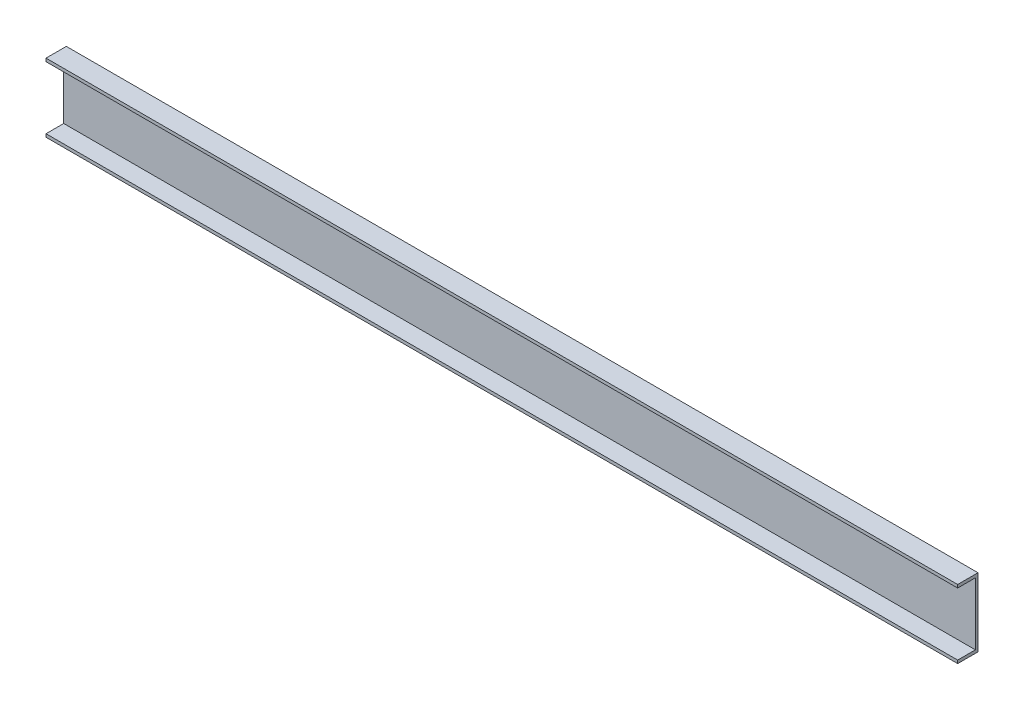
ISO-10303-21;
HEADER;
FILE_DESCRIPTION(('STEP AP214'),'2;1');
FILE_NAME('part.step','',(''),(''),'','','');
FILE_SCHEMA(('AUTOMOTIVE_DESIGN { 1 0 10303 214 1 1 1 1 }'));
ENDSEC;
DATA;
#1=APPLICATION_CONTEXT('core data for automotive mechanical design processes');
#2=APPLICATION_PROTOCOL_DEFINITION('international standard','automotive_design',2000,#1);
#3=PRODUCT_CONTEXT('',#1,'mechanical');
#4=PRODUCT('Part','Part','',(#3));
#5=PRODUCT_RELATED_PRODUCT_CATEGORY('part','',(#4));
#6=PRODUCT_DEFINITION_FORMATION('','',#4);
#7=PRODUCT_DEFINITION_CONTEXT('part definition',#1,'design');
#8=PRODUCT_DEFINITION('design','',#6,#7);
#9=PRODUCT_DEFINITION_SHAPE('','',#8);
#10=(LENGTH_UNIT() NAMED_UNIT(*) SI_UNIT(.MILLI.,.METRE.));
#11=(NAMED_UNIT(*) PLANE_ANGLE_UNIT() SI_UNIT($,.RADIAN.));
#12=(NAMED_UNIT(*) SI_UNIT($,.STERADIAN.) SOLID_ANGLE_UNIT());
#13=UNCERTAINTY_MEASURE_WITH_UNIT(LENGTH_MEASURE(1.E-05),#10,'distance_accuracy_value','');
#14=(GEOMETRIC_REPRESENTATION_CONTEXT(3) GLOBAL_UNCERTAINTY_ASSIGNED_CONTEXT((#13)) GLOBAL_UNIT_ASSIGNED_CONTEXT((#10,
#11,#12)) REPRESENTATION_CONTEXT('',''));
#15=CARTESIAN_POINT('',(0.,0.,0.));
#16=DIRECTION('',(0.,0.,1.));
#17=DIRECTION('',(1.,0.,0.));
#18=AXIS2_PLACEMENT_3D('',#15,#16,#17);
#19=CARTESIAN_POINT('',(-1995.,-150.,0.));
#20=DIRECTION('',(0.,0.,1.));
#21=DIRECTION('',(1.,0.,0.));
#22=AXIS2_PLACEMENT_3D('',#19,#20,#21);
#23=PLANE('',#22);
#24=DIRECTION('',(1.,0.,0.));
#25=VECTOR('',#24,1.);
#26=CARTESIAN_POINT('',(-1995.,-150.,0.));
#27=LINE('',#26,#25);
#28=CARTESIAN_POINT('',(-1995.,-150.,0.));
#29=VERTEX_POINT('',#28);
#30=CARTESIAN_POINT('',(1995.,-150.,0.));
#31=VERTEX_POINT('',#30);
#32=EDGE_CURVE('E481',#29,#31,#27,.T.);
#33=ORIENTED_EDGE('',*,*,#32,.F.);
#34=DIRECTION('',(0.,-1.,0.));
#35=VECTOR('',#34,1.);
#36=CARTESIAN_POINT('',(-1995.,150.,0.));
#37=LINE('',#36,#35);
#38=CARTESIAN_POINT('',(-1995.,150.,0.));
#39=VERTEX_POINT('',#38);
#40=EDGE_CURVE('E473',#39,#29,#37,.T.);
#41=ORIENTED_EDGE('',*,*,#40,.F.);
#42=DIRECTION('',(-1.,0.,0.));
#43=VECTOR('',#42,1.);
#44=CARTESIAN_POINT('',(-1995.,150.,0.));
#45=LINE('',#44,#43);
#46=CARTESIAN_POINT('',(1995.,150.,0.));
#47=VERTEX_POINT('',#46);
#48=EDGE_CURVE('E477',#47,#39,#45,.T.);
#49=ORIENTED_EDGE('',*,*,#48,.F.);
#50=DIRECTION('',(0.,1.,0.));
#51=VECTOR('',#50,1.);
#52=CARTESIAN_POINT('',(1995.,150.,0.));
#53=LINE('',#52,#51);
#54=EDGE_CURVE('E483',#31,#47,#53,.T.);
#55=ORIENTED_EDGE('',*,*,#54,.F.);
#56=EDGE_LOOP('',(#33,#41,#49,#55));
#57=FACE_BOUND('',#56,.T.);
#58=DIRECTION('',(1.,0.,0.));
#59=VECTOR('',#58,1.);
#60=CARTESIAN_POINT('',(-935.,115.,0.));
#61=LINE('',#60,#59);
#62=CARTESIAN_POINT('',(-935.,115.,0.));
#63=VERTEX_POINT('',#62);
#64=CARTESIAN_POINT('',(-865.,115.,0.));
#65=VERTEX_POINT('',#64);
#66=EDGE_CURVE('E264',#63,#65,#61,.T.);
#67=ORIENTED_EDGE('',*,*,#66,.F.);
#68=DIRECTION('',(0.,1.,0.));
#69=VECTOR('',#68,1.);
#70=CARTESIAN_POINT('',(-935.,115.,0.));
#71=LINE('',#70,#69);
#72=CARTESIAN_POINT('',(-935.,-115.,0.));
#73=VERTEX_POINT('',#72);
#74=EDGE_CURVE('E277',#73,#63,#71,.T.);
#75=ORIENTED_EDGE('',*,*,#74,.F.);
#76=DIRECTION('',(-1.,0.,0.));
#77=VECTOR('',#76,1.);
#78=CARTESIAN_POINT('',(-935.,-115.,0.));
#79=LINE('',#78,#77);
#80=CARTESIAN_POINT('',(-865.,-115.,0.));
#81=VERTEX_POINT('',#80);
#82=EDGE_CURVE('E286',#81,#73,#79,.T.);
#83=ORIENTED_EDGE('',*,*,#82,.F.);
#84=DIRECTION('',(0.,-1.,0.));
#85=VECTOR('',#84,1.);
#86=CARTESIAN_POINT('',(-865.,115.,0.));
#87=LINE('',#86,#85);
#88=EDGE_CURVE('E267',#65,#81,#87,.T.);
#89=ORIENTED_EDGE('',*,*,#88,.F.);
#90=EDGE_LOOP('',(#67,#75,#83,#89));
#91=FACE_BOUND('',#90,.T.);
#92=DIRECTION('',(0.,-1.,0.));
#93=VECTOR('',#92,1.);
#94=CARTESIAN_POINT('',(535.,115.,0.));
#95=LINE('',#94,#93);
#96=CARTESIAN_POINT('',(535.,115.,0.));
#97=VERTEX_POINT('',#96);
#98=CARTESIAN_POINT('',(535.,-115.,0.));
#99=VERTEX_POINT('',#98);
#100=EDGE_CURVE('E335',#97,#99,#95,.T.);
#101=ORIENTED_EDGE('',*,*,#100,.F.);
#102=DIRECTION('',(1.,0.,0.));
#103=VECTOR('',#102,1.);
#104=CARTESIAN_POINT('',(535.,115.,0.));
#105=LINE('',#104,#103);
#106=CARTESIAN_POINT('',(465.,115.,0.));
#107=VERTEX_POINT('',#106);
#108=EDGE_CURVE('E340',#107,#97,#105,.T.);
#109=ORIENTED_EDGE('',*,*,#108,.F.);
#110=DIRECTION('',(0.,1.,0.));
#111=VECTOR('',#110,1.);
#112=CARTESIAN_POINT('',(465.,115.,0.));
#113=LINE('',#112,#111);
#114=CARTESIAN_POINT('',(465.,-115.,0.));
#115=VERTEX_POINT('',#114);
#116=EDGE_CURVE('E352',#115,#107,#113,.T.);
#117=ORIENTED_EDGE('',*,*,#116,.F.);
#118=DIRECTION('',(-1.,0.,0.));
#119=VECTOR('',#118,1.);
#120=CARTESIAN_POINT('',(535.,-115.,0.));
#121=LINE('',#120,#119);
#122=EDGE_CURVE('E349',#99,#115,#121,.T.);
#123=ORIENTED_EDGE('',*,*,#122,.F.);
#124=EDGE_LOOP('',(#101,#109,#117,#123));
#125=FACE_BOUND('',#124,.T.);
#126=DIRECTION('',(0.,-1.,0.));
#127=VECTOR('',#126,1.);
#128=CARTESIAN_POINT('',(1335.,115.,0.));
#129=LINE('',#128,#127);
#130=CARTESIAN_POINT('',(1335.,115.,0.));
#131=VERTEX_POINT('',#130);
#132=CARTESIAN_POINT('',(1335.,-115.,0.));
#133=VERTEX_POINT('',#132);
#134=EDGE_CURVE('E401',#131,#133,#129,.T.);
#135=ORIENTED_EDGE('',*,*,#134,.F.);
#136=DIRECTION('',(1.,0.,0.));
#137=VECTOR('',#136,1.);
#138=CARTESIAN_POINT('',(1335.,115.,0.));
#139=LINE('',#138,#137);
#140=CARTESIAN_POINT('',(1265.,115.,0.));
#141=VERTEX_POINT('',#140);
#142=EDGE_CURVE('E406',#141,#131,#139,.T.);
#143=ORIENTED_EDGE('',*,*,#142,.F.);
#144=DIRECTION('',(0.,1.,0.));
#145=VECTOR('',#144,1.);
#146=CARTESIAN_POINT('',(1265.,115.,0.));
#147=LINE('',#146,#145);
#148=CARTESIAN_POINT('',(1265.,-115.,0.));
#149=VERTEX_POINT('',#148);
#150=EDGE_CURVE('E418',#149,#141,#147,.T.);
#151=ORIENTED_EDGE('',*,*,#150,.F.);
#152=DIRECTION('',(-1.,0.,0.));
#153=VECTOR('',#152,1.);
#154=CARTESIAN_POINT('',(1335.,-115.,0.));
#155=LINE('',#154,#153);
#156=EDGE_CURVE('E415',#133,#149,#155,.T.);
#157=ORIENTED_EDGE('',*,*,#156,.F.);
#158=EDGE_LOOP('',(#135,#143,#151,#157));
#159=FACE_BOUND('',#158,.T.);
#160=DIRECTION('',(0.,-1.,0.));
#161=VECTOR('',#160,1.);
#162=CARTESIAN_POINT('',(935.,115.,0.));
#163=LINE('',#162,#161);
#164=CARTESIAN_POINT('',(935.,115.,0.));
#165=VERTEX_POINT('',#164);
#166=CARTESIAN_POINT('',(935.,-115.,0.));
#167=VERTEX_POINT('',#166);
#168=EDGE_CURVE('E368',#165,#167,#163,.T.);
#169=ORIENTED_EDGE('',*,*,#168,.F.);
#170=DIRECTION('',(1.,0.,0.));
#171=VECTOR('',#170,1.);
#172=CARTESIAN_POINT('',(935.,115.,0.));
#173=LINE('',#172,#171);
#174=CARTESIAN_POINT('',(865.,115.,0.));
#175=VERTEX_POINT('',#174);
#176=EDGE_CURVE('E373',#175,#165,#173,.T.);
#177=ORIENTED_EDGE('',*,*,#176,.F.);
#178=DIRECTION('',(0.,1.,0.));
#179=VECTOR('',#178,1.);
#180=CARTESIAN_POINT('',(865.,115.,0.));
#181=LINE('',#180,#179);
#182=CARTESIAN_POINT('',(865.,-115.,0.));
#183=VERTEX_POINT('',#182);
#184=EDGE_CURVE('E385',#183,#175,#181,.T.);
#185=ORIENTED_EDGE('',*,*,#184,.F.);
#186=DIRECTION('',(-1.,0.,0.));
#187=VECTOR('',#186,1.);
#188=CARTESIAN_POINT('',(935.,-115.,0.));
#189=LINE('',#188,#187);
#190=EDGE_CURVE('E382',#167,#183,#189,.T.);
#191=ORIENTED_EDGE('',*,*,#190,.F.);
#192=EDGE_LOOP('',(#169,#177,#185,#191));
#193=FACE_BOUND('',#192,.T.);
#194=DIRECTION('',(1.,0.,0.));
#195=VECTOR('',#194,1.);
#196=CARTESIAN_POINT('',(-535.,115.,0.));
#197=LINE('',#196,#195);
#198=CARTESIAN_POINT('',(-535.,115.,0.));
#199=VERTEX_POINT('',#198);
#200=CARTESIAN_POINT('',(-465.,115.,0.));
#201=VERTEX_POINT('',#200);
#202=EDGE_CURVE('E302',#199,#201,#197,.T.);
#203=ORIENTED_EDGE('',*,*,#202,.F.);
#204=DIRECTION('',(0.,1.,0.));
#205=VECTOR('',#204,1.);
#206=CARTESIAN_POINT('',(-535.,115.,0.));
#207=LINE('',#206,#205);
#208=CARTESIAN_POINT('',(-535.,-115.,0.));
#209=VERTEX_POINT('',#208);
#210=EDGE_CURVE('E307',#209,#199,#207,.T.);
#211=ORIENTED_EDGE('',*,*,#210,.F.);
#212=DIRECTION('',(-1.,0.,0.));
#213=VECTOR('',#212,1.);
#214=CARTESIAN_POINT('',(-535.,-115.,0.));
#215=LINE('',#214,#213);
#216=CARTESIAN_POINT('',(-465.,-115.,0.));
#217=VERTEX_POINT('',#216);
#218=EDGE_CURVE('E319',#217,#209,#215,.T.);
#219=ORIENTED_EDGE('',*,*,#218,.F.);
#220=DIRECTION('',(0.,-1.,0.));
#221=VECTOR('',#220,1.);
#222=CARTESIAN_POINT('',(-465.,115.,0.));
#223=LINE('',#222,#221);
#224=EDGE_CURVE('E316',#201,#217,#223,.T.);
#225=ORIENTED_EDGE('',*,*,#224,.F.);
#226=EDGE_LOOP('',(#203,#211,#219,#225));
#227=FACE_BOUND('',#226,.T.);
#228=DIRECTION('',(1.,0.,0.));
#229=VECTOR('',#228,1.);
#230=CARTESIAN_POINT('',(-1335.,115.,0.));
#231=LINE('',#230,#229);
#232=CARTESIAN_POINT('',(-1335.,115.,0.));
#233=VERTEX_POINT('',#232);
#234=CARTESIAN_POINT('',(-1265.,115.,0.));
#235=VERTEX_POINT('',#234);
#236=EDGE_CURVE('E263',#233,#235,#231,.T.);
#237=ORIENTED_EDGE('',*,*,#236,.F.);
#238=DIRECTION('',(0.,1.,0.));
#239=VECTOR('',#238,1.);
#240=CARTESIAN_POINT('',(-1335.,115.,0.));
#241=LINE('',#240,#239);
#242=CARTESIAN_POINT('',(-1335.,-115.,0.));
#243=VERTEX_POINT('',#242);
#244=EDGE_CURVE('E260',#243,#233,#241,.T.);
#245=ORIENTED_EDGE('',*,*,#244,.F.);
#246=DIRECTION('',(-1.,0.,0.));
#247=VECTOR('',#246,1.);
#248=CARTESIAN_POINT('',(-1335.,-115.,0.));
#249=LINE('',#248,#247);
#250=CARTESIAN_POINT('',(-1265.,-115.,0.));
#251=VERTEX_POINT('',#250);
#252=EDGE_CURVE('E54',#251,#243,#249,.T.);
#253=ORIENTED_EDGE('',*,*,#252,.F.);
#254=DIRECTION('',(0.,-1.,0.));
#255=VECTOR('',#254,1.);
#256=CARTESIAN_POINT('',(-1265.,115.,0.));
#257=LINE('',#256,#255);
#258=EDGE_CURVE('E49',#235,#251,#257,.T.);
#259=ORIENTED_EDGE('',*,*,#258,.F.);
#260=EDGE_LOOP('',(#237,#245,#253,#259));
#261=FACE_BOUND('',#260,.T.);
#262=ADVANCED_FACE('F34',(#57,#91,#125,#159,#193,#227,#261),#23,.F.);
#263=CARTESIAN_POINT('',(-1995.,-150.,11.5));
#264=DIRECTION('',(0.,0.,1.));
#265=DIRECTION('',(1.,0.,0.));
#266=AXIS2_PLACEMENT_3D('',#263,#264,#265);
#267=PLANE('',#266);
#268=DIRECTION('',(0.,-1.,0.));
#269=VECTOR('',#268,1.);
#270=CARTESIAN_POINT('',(-1995.,150.,11.5));
#271=LINE('',#270,#269);
#272=CARTESIAN_POINT('',(-1995.,136.5,11.5));
#273=VERTEX_POINT('',#272);
#274=CARTESIAN_POINT('',(-1995.,-136.5,11.5));
#275=VERTEX_POINT('',#274);
#276=EDGE_CURVE('E474',#273,#275,#271,.T.);
#277=ORIENTED_EDGE('',*,*,#276,.T.);
#278=DIRECTION('',(-1.,0.,0.));
#279=VECTOR('',#278,1.);
#280=CARTESIAN_POINT('',(-1995.,-136.5,11.5));
#281=LINE('',#280,#279);
#282=CARTESIAN_POINT('',(1995.,-136.5,11.5));
#283=VERTEX_POINT('',#282);
#284=EDGE_CURVE('E434',#283,#275,#281,.T.);
#285=ORIENTED_EDGE('',*,*,#284,.F.);
#286=DIRECTION('',(0.,1.,0.));
#287=VECTOR('',#286,1.);
#288=CARTESIAN_POINT('',(1995.,150.,11.5));
#289=LINE('',#288,#287);
#290=CARTESIAN_POINT('',(1995.,136.5,11.5));
#291=VERTEX_POINT('',#290);
#292=EDGE_CURVE('E476',#283,#291,#289,.T.);
#293=ORIENTED_EDGE('',*,*,#292,.T.);
#294=DIRECTION('',(1.,0.,0.));
#295=VECTOR('',#294,1.);
#296=CARTESIAN_POINT('',(-1995.,136.5,11.5));
#297=LINE('',#296,#295);
#298=EDGE_CURVE('E453',#273,#291,#297,.T.);
#299=ORIENTED_EDGE('',*,*,#298,.F.);
#300=EDGE_LOOP('',(#277,#285,#293,#299));
#301=FACE_BOUND('',#300,.T.);
#302=ADVANCED_FACE('F518',(#301),#267,.T.);
#303=CARTESIAN_POINT('',(-1995.,150.,11.5));
#304=DIRECTION('',(1.,0.,0.));
#305=DIRECTION('',(0.,0.,-1.));
#306=AXIS2_PLACEMENT_3D('',#303,#304,#305);
#307=PLANE('',#306);
#308=DIRECTION('',(0.,0.,-1.));
#309=VECTOR('',#308,1.);
#310=CARTESIAN_POINT('',(-1995.,-136.5,89.));
#311=LINE('',#310,#309);
#312=CARTESIAN_POINT('',(-1995.,-136.5,89.));
#313=VERTEX_POINT('',#312);
#314=EDGE_CURVE('E445',#313,#275,#311,.T.);
#315=ORIENTED_EDGE('',*,*,#314,.T.);
#316=ORIENTED_EDGE('',*,*,#276,.F.);
#317=DIRECTION('',(0.,0.,-1.));
#318=VECTOR('',#317,1.);
#319=CARTESIAN_POINT('',(-1995.,136.5,89.));
#320=LINE('',#319,#318);
#321=CARTESIAN_POINT('',(-1995.,136.5,89.));
#322=VERTEX_POINT('',#321);
#323=EDGE_CURVE('E470',#322,#273,#320,.T.);
#324=ORIENTED_EDGE('',*,*,#323,.F.);
#325=DIRECTION('',(0.,-1.,0.));
#326=VECTOR('',#325,1.);
#327=CARTESIAN_POINT('',(-1995.,150.,89.));
#328=LINE('',#327,#326);
#329=CARTESIAN_POINT('',(-1995.,150.,89.));
#330=VERTEX_POINT('',#329);
#331=EDGE_CURVE('E454',#330,#322,#328,.T.);
#332=ORIENTED_EDGE('',*,*,#331,.F.);
#333=DIRECTION('',(0.,0.,-1.));
#334=VECTOR('',#333,1.);
#335=CARTESIAN_POINT('',(-1995.,150.,11.5));
#336=LINE('',#335,#334);
#337=EDGE_CURVE('E479',#330,#39,#336,.T.);
#338=ORIENTED_EDGE('',*,*,#337,.T.);
#339=ORIENTED_EDGE('',*,*,#40,.T.);
#340=DIRECTION('',(0.,0.,-1.));
#341=VECTOR('',#340,1.);
#342=CARTESIAN_POINT('',(-1995.,-150.,11.5));
#343=LINE('',#342,#341);
#344=CARTESIAN_POINT('',(-1995.,-150.,89.));
#345=VERTEX_POINT('',#344);
#346=EDGE_CURVE('E11',#345,#29,#343,.T.);
#347=ORIENTED_EDGE('',*,*,#346,.F.);
#348=DIRECTION('',(0.,-1.,0.));
#349=VECTOR('',#348,1.);
#350=CARTESIAN_POINT('',(-1995.,-150.,89.));
#351=LINE('',#350,#349);
#352=EDGE_CURVE('E442',#313,#345,#351,.T.);
#353=ORIENTED_EDGE('',*,*,#352,.F.);
#354=EDGE_LOOP('',(#315,#316,#324,#332,#338,#339,#347,#353));
#355=FACE_BOUND('',#354,.T.);
#356=ADVANCED_FACE('F36',(#355),#307,.F.);
#357=CARTESIAN_POINT('',(-1995.,-150.,11.5));
#358=DIRECTION('',(0.,1.,0.));
#359=DIRECTION('',(-1.,0.,0.));
#360=AXIS2_PLACEMENT_3D('',#357,#358,#359);
#361=PLANE('',#360);
#362=ORIENTED_EDGE('',*,*,#32,.T.);
#363=DIRECTION('',(0.,0.,-1.));
#364=VECTOR('',#363,1.);
#365=CARTESIAN_POINT('',(1995.,-150.,11.5));
#366=LINE('',#365,#364);
#367=CARTESIAN_POINT('',(1995.,-150.,89.));
#368=VERTEX_POINT('',#367);
#369=EDGE_CURVE('E42',#368,#31,#366,.T.);
#370=ORIENTED_EDGE('',*,*,#369,.F.);
#371=DIRECTION('',(1.,0.,0.));
#372=VECTOR('',#371,1.);
#373=CARTESIAN_POINT('',(-1995.,-150.,89.));
#374=LINE('',#373,#372);
#375=EDGE_CURVE('E435',#345,#368,#374,.T.);
#376=ORIENTED_EDGE('',*,*,#375,.F.);
#377=ORIENTED_EDGE('',*,*,#346,.T.);
#378=EDGE_LOOP('',(#362,#370,#376,#377));
#379=FACE_BOUND('',#378,.T.);
#380=ADVANCED_FACE('F526',(#379),#361,.F.);
#381=CARTESIAN_POINT('',(1995.,150.,11.5));
#382=DIRECTION('',(-1.,0.,0.));
#383=DIRECTION('',(0.,0.,1.));
#384=AXIS2_PLACEMENT_3D('',#381,#382,#383);
#385=PLANE('',#384);
#386=ORIENTED_EDGE('',*,*,#54,.T.);
#387=DIRECTION('',(0.,0.,-1.));
#388=VECTOR('',#387,1.);
#389=CARTESIAN_POINT('',(1995.,150.,11.5));
#390=LINE('',#389,#388);
#391=CARTESIAN_POINT('',(1995.,150.,89.));
#392=VERTEX_POINT('',#391);
#393=EDGE_CURVE('E488',#392,#47,#390,.T.);
#394=ORIENTED_EDGE('',*,*,#393,.F.);
#395=DIRECTION('',(0.,1.,0.));
#396=VECTOR('',#395,1.);
#397=CARTESIAN_POINT('',(1995.,150.,89.));
#398=LINE('',#397,#396);
#399=CARTESIAN_POINT('',(1995.,136.5,89.));
#400=VERTEX_POINT('',#399);
#401=EDGE_CURVE('E459',#400,#392,#398,.T.);
#402=ORIENTED_EDGE('',*,*,#401,.F.);
#403=DIRECTION('',(0.,0.,-1.));
#404=VECTOR('',#403,1.);
#405=CARTESIAN_POINT('',(1995.,136.5,89.));
#406=LINE('',#405,#404);
#407=EDGE_CURVE('E465',#400,#291,#406,.T.);
#408=ORIENTED_EDGE('',*,*,#407,.T.);
#409=ORIENTED_EDGE('',*,*,#292,.F.);
#410=DIRECTION('',(0.,0.,-1.));
#411=VECTOR('',#410,1.);
#412=CARTESIAN_POINT('',(1995.,-136.5,89.));
#413=LINE('',#412,#411);
#414=CARTESIAN_POINT('',(1995.,-136.5,89.));
#415=VERTEX_POINT('',#414);
#416=EDGE_CURVE('E450',#415,#283,#413,.T.);
#417=ORIENTED_EDGE('',*,*,#416,.F.);
#418=DIRECTION('',(0.,1.,0.));
#419=VECTOR('',#418,1.);
#420=CARTESIAN_POINT('',(1995.,-150.,89.));
#421=LINE('',#420,#419);
#422=EDGE_CURVE('E438',#368,#415,#421,.T.);
#423=ORIENTED_EDGE('',*,*,#422,.F.);
#424=ORIENTED_EDGE('',*,*,#369,.T.);
#425=EDGE_LOOP('',(#386,#394,#402,#408,#409,#417,#423,#424));
#426=FACE_BOUND('',#425,.T.);
#427=ADVANCED_FACE('F494',(#426),#385,.F.);
#428=CARTESIAN_POINT('',(-1995.,150.,11.5));
#429=DIRECTION('',(0.,-1.,0.));
#430=DIRECTION('',(1.,0.,0.));
#431=AXIS2_PLACEMENT_3D('',#428,#429,#430);
#432=PLANE('',#431);
#433=ORIENTED_EDGE('',*,*,#48,.T.);
#434=ORIENTED_EDGE('',*,*,#337,.F.);
#435=DIRECTION('',(-1.,0.,0.));
#436=VECTOR('',#435,1.);
#437=CARTESIAN_POINT('',(-1995.,150.,89.));
#438=LINE('',#437,#436);
#439=EDGE_CURVE('E462',#392,#330,#438,.T.);
#440=ORIENTED_EDGE('',*,*,#439,.F.);
#441=ORIENTED_EDGE('',*,*,#393,.T.);
#442=EDGE_LOOP('',(#433,#434,#440,#441));
#443=FACE_BOUND('',#442,.T.);
#444=ADVANCED_FACE('F504',(#443),#432,.F.);
#445=CARTESIAN_POINT('',(-1995.,136.5,89.));
#446=DIRECTION('',(0.,1.,0.));
#447=DIRECTION('',(0.,0.,1.));
#448=AXIS2_PLACEMENT_3D('',#445,#446,#447);
#449=PLANE('',#448);
#450=ORIENTED_EDGE('',*,*,#298,.T.);
#451=ORIENTED_EDGE('',*,*,#407,.F.);
#452=DIRECTION('',(1.,0.,0.));
#453=VECTOR('',#452,1.);
#454=CARTESIAN_POINT('',(-1995.,136.5,89.));
#455=LINE('',#454,#453);
#456=EDGE_CURVE('E457',#322,#400,#455,.T.);
#457=ORIENTED_EDGE('',*,*,#456,.F.);
#458=ORIENTED_EDGE('',*,*,#323,.T.);
#459=EDGE_LOOP('',(#450,#451,#457,#458));
#460=FACE_BOUND('',#459,.T.);
#461=ADVANCED_FACE('F516',(#460),#449,.F.);
#462=CARTESIAN_POINT('',(-1995.,136.5,89.));
#463=DIRECTION('',(0.,0.,1.));
#464=DIRECTION('',(1.,0.,0.));
#465=AXIS2_PLACEMENT_3D('',#462,#463,#464);
#466=PLANE('',#465);
#467=ORIENTED_EDGE('',*,*,#331,.T.);
#468=ORIENTED_EDGE('',*,*,#456,.T.);
#469=ORIENTED_EDGE('',*,*,#401,.T.);
#470=ORIENTED_EDGE('',*,*,#439,.T.);
#471=EDGE_LOOP('',(#467,#468,#469,#470));
#472=FACE_BOUND('',#471,.T.);
#473=ADVANCED_FACE('F511',(#472),#466,.T.);
#474=CARTESIAN_POINT('',(-1995.,-136.5,89.));
#475=DIRECTION('',(0.,-1.,0.));
#476=DIRECTION('',(0.,0.,-1.));
#477=AXIS2_PLACEMENT_3D('',#474,#475,#476);
#478=PLANE('',#477);
#479=ORIENTED_EDGE('',*,*,#284,.T.);
#480=ORIENTED_EDGE('',*,*,#314,.F.);
#481=DIRECTION('',(-1.,0.,0.));
#482=VECTOR('',#481,1.);
#483=CARTESIAN_POINT('',(-1995.,-136.5,89.));
#484=LINE('',#483,#482);
#485=EDGE_CURVE('E440',#415,#313,#484,.T.);
#486=ORIENTED_EDGE('',*,*,#485,.F.);
#487=ORIENTED_EDGE('',*,*,#416,.T.);
#488=EDGE_LOOP('',(#479,#480,#486,#487));
#489=FACE_BOUND('',#488,.T.);
#490=ADVANCED_FACE('F523',(#489),#478,.F.);
#491=CARTESIAN_POINT('',(1995.,-150.,89.));
#492=DIRECTION('',(0.,0.,1.));
#493=DIRECTION('',(1.,0.,0.));
#494=AXIS2_PLACEMENT_3D('',#491,#492,#493);
#495=PLANE('',#494);
#496=ORIENTED_EDGE('',*,*,#375,.T.);
#497=ORIENTED_EDGE('',*,*,#422,.T.);
#498=ORIENTED_EDGE('',*,*,#485,.T.);
#499=ORIENTED_EDGE('',*,*,#352,.T.);
#500=EDGE_LOOP('',(#496,#497,#498,#499));
#501=FACE_BOUND('',#500,.T.);
#502=ADVANCED_FACE('F525',(#501),#495,.T.);
#503=CARTESIAN_POINT('',(1335.,115.,-16.));
#504=DIRECTION('',(-1.,0.,0.));
#505=DIRECTION('',(0.,0.,1.));
#506=AXIS2_PLACEMENT_3D('',#503,#504,#505);
#507=PLANE('',#506);
#508=ORIENTED_EDGE('',*,*,#134,.T.);
#509=DIRECTION('',(0.,0.,1.));
#510=VECTOR('',#509,1.);
#511=CARTESIAN_POINT('',(1335.,-115.,-16.));
#512=LINE('',#511,#510);
#513=CARTESIAN_POINT('',(1335.,-115.,-16.));
#514=VERTEX_POINT('',#513);
#515=EDGE_CURVE('E431',#514,#133,#512,.T.);
#516=ORIENTED_EDGE('',*,*,#515,.F.);
#517=DIRECTION('',(0.,-1.,0.));
#518=VECTOR('',#517,1.);
#519=CARTESIAN_POINT('',(1335.,115.,-16.));
#520=LINE('',#519,#518);
#521=CARTESIAN_POINT('',(1335.,115.,-16.));
#522=VERTEX_POINT('',#521);
#523=EDGE_CURVE('E402',#522,#514,#520,.T.);
#524=ORIENTED_EDGE('',*,*,#523,.F.);
#525=DIRECTION('',(0.,0.,1.));
#526=VECTOR('',#525,1.);
#527=CARTESIAN_POINT('',(1335.,115.,-16.));
#528=LINE('',#527,#526);
#529=EDGE_CURVE('E412',#522,#131,#528,.T.);
#530=ORIENTED_EDGE('',*,*,#529,.T.);
#531=EDGE_LOOP('',(#508,#516,#524,#530));
#532=FACE_BOUND('',#531,.T.);
#533=ADVANCED_FACE('F554',(#532),#507,.F.);
#534=CARTESIAN_POINT('',(1335.,-115.,-16.));
#535=DIRECTION('',(0.,1.,0.));
#536=DIRECTION('',(0.,0.,1.));
#537=AXIS2_PLACEMENT_3D('',#534,#535,#536);
#538=PLANE('',#537);
#539=ORIENTED_EDGE('',*,*,#156,.T.);
#540=DIRECTION('',(0.,0.,1.));
#541=VECTOR('',#540,1.);
#542=CARTESIAN_POINT('',(1265.,-115.,-16.));
#543=LINE('',#542,#541);
#544=CARTESIAN_POINT('',(1265.,-115.,-16.));
#545=VERTEX_POINT('',#544);
#546=EDGE_CURVE('E428',#545,#149,#543,.T.);
#547=ORIENTED_EDGE('',*,*,#546,.F.);
#548=DIRECTION('',(-1.,0.,0.));
#549=VECTOR('',#548,1.);
#550=CARTESIAN_POINT('',(1335.,-115.,-16.));
#551=LINE('',#550,#549);
#552=EDGE_CURVE('E405',#514,#545,#551,.T.);
#553=ORIENTED_EDGE('',*,*,#552,.F.);
#554=ORIENTED_EDGE('',*,*,#515,.T.);
#555=EDGE_LOOP('',(#539,#547,#553,#554));
#556=FACE_BOUND('',#555,.T.);
#557=ADVANCED_FACE('F557',(#556),#538,.F.);
#558=CARTESIAN_POINT('',(1265.,115.,-16.));
#559=DIRECTION('',(1.,0.,0.));
#560=DIRECTION('',(0.,0.,-1.));
#561=AXIS2_PLACEMENT_3D('',#558,#559,#560);
#562=PLANE('',#561);
#563=ORIENTED_EDGE('',*,*,#150,.T.);
#564=DIRECTION('',(0.,0.,1.));
#565=VECTOR('',#564,1.);
#566=CARTESIAN_POINT('',(1265.,115.,-16.));
#567=LINE('',#566,#565);
#568=CARTESIAN_POINT('',(1265.,115.,-16.));
#569=VERTEX_POINT('',#568);
#570=EDGE_CURVE('E425',#569,#141,#567,.T.);
#571=ORIENTED_EDGE('',*,*,#570,.F.);
#572=DIRECTION('',(0.,1.,0.));
#573=VECTOR('',#572,1.);
#574=CARTESIAN_POINT('',(1265.,115.,-16.));
#575=LINE('',#574,#573);
#576=EDGE_CURVE('E408',#545,#569,#575,.T.);
#577=ORIENTED_EDGE('',*,*,#576,.F.);
#578=ORIENTED_EDGE('',*,*,#546,.T.);
#579=EDGE_LOOP('',(#563,#571,#577,#578));
#580=FACE_BOUND('',#579,.T.);
#581=ADVANCED_FACE('F561',(#580),#562,.F.);
#582=CARTESIAN_POINT('',(1335.,115.,-16.));
#583=DIRECTION('',(0.,-1.,0.));
#584=DIRECTION('',(0.,0.,-1.));
#585=AXIS2_PLACEMENT_3D('',#582,#583,#584);
#586=PLANE('',#585);
#587=ORIENTED_EDGE('',*,*,#142,.T.);
#588=ORIENTED_EDGE('',*,*,#529,.F.);
#589=DIRECTION('',(1.,0.,0.));
#590=VECTOR('',#589,1.);
#591=CARTESIAN_POINT('',(1335.,115.,-16.));
#592=LINE('',#591,#590);
#593=EDGE_CURVE('E410',#569,#522,#592,.T.);
#594=ORIENTED_EDGE('',*,*,#593,.F.);
#595=ORIENTED_EDGE('',*,*,#570,.T.);
#596=EDGE_LOOP('',(#587,#588,#594,#595));
#597=FACE_BOUND('',#596,.T.);
#598=ADVANCED_FACE('F565',(#597),#586,.F.);
#599=CARTESIAN_POINT('',(1335.,-115.,-16.));
#600=DIRECTION('',(0.,0.,-1.));
#601=DIRECTION('',(-1.,0.,0.));
#602=AXIS2_PLACEMENT_3D('',#599,#600,#601);
#603=PLANE('',#602);
#604=ORIENTED_EDGE('',*,*,#523,.T.);
#605=ORIENTED_EDGE('',*,*,#552,.T.);
#606=ORIENTED_EDGE('',*,*,#576,.T.);
#607=ORIENTED_EDGE('',*,*,#593,.T.);
#608=EDGE_LOOP('',(#604,#605,#606,#607));
#609=FACE_BOUND('',#608,.T.);
#610=ADVANCED_FACE('F569',(#609),#603,.T.);
#611=CARTESIAN_POINT('',(935.,115.,-16.));
#612=DIRECTION('',(-1.,0.,0.));
#613=DIRECTION('',(0.,0.,1.));
#614=AXIS2_PLACEMENT_3D('',#611,#612,#613);
#615=PLANE('',#614);
#616=ORIENTED_EDGE('',*,*,#168,.T.);
#617=DIRECTION('',(0.,0.,1.));
#618=VECTOR('',#617,1.);
#619=CARTESIAN_POINT('',(935.,-115.,-16.));
#620=LINE('',#619,#618);
#621=CARTESIAN_POINT('',(935.,-115.,-16.));
#622=VERTEX_POINT('',#621);
#623=EDGE_CURVE('E398',#622,#167,#620,.T.);
#624=ORIENTED_EDGE('',*,*,#623,.F.);
#625=DIRECTION('',(0.,-1.,0.));
#626=VECTOR('',#625,1.);
#627=CARTESIAN_POINT('',(935.,115.,-16.));
#628=LINE('',#627,#626);
#629=CARTESIAN_POINT('',(935.,115.,-16.));
#630=VERTEX_POINT('',#629);
#631=EDGE_CURVE('E369',#630,#622,#628,.T.);
#632=ORIENTED_EDGE('',*,*,#631,.F.);
#633=DIRECTION('',(0.,0.,1.));
#634=VECTOR('',#633,1.);
#635=CARTESIAN_POINT('',(935.,115.,-16.));
#636=LINE('',#635,#634);
#637=EDGE_CURVE('E379',#630,#165,#636,.T.);
#638=ORIENTED_EDGE('',*,*,#637,.T.);
#639=EDGE_LOOP('',(#616,#624,#632,#638));
#640=FACE_BOUND('',#639,.T.);
#641=ADVANCED_FACE('F573',(#640),#615,.F.);
#642=CARTESIAN_POINT('',(935.,-115.,-16.));
#643=DIRECTION('',(0.,1.,0.));
#644=DIRECTION('',(-1.,0.,0.));
#645=AXIS2_PLACEMENT_3D('',#642,#643,#644);
#646=PLANE('',#645);
#647=ORIENTED_EDGE('',*,*,#190,.T.);
#648=DIRECTION('',(0.,0.,1.));
#649=VECTOR('',#648,1.);
#650=CARTESIAN_POINT('',(865.,-115.,-16.));
#651=LINE('',#650,#649);
#652=CARTESIAN_POINT('',(865.,-115.,-16.));
#653=VERTEX_POINT('',#652);
#654=EDGE_CURVE('E395',#653,#183,#651,.T.);
#655=ORIENTED_EDGE('',*,*,#654,.F.);
#656=DIRECTION('',(-1.,0.,0.));
#657=VECTOR('',#656,1.);
#658=CARTESIAN_POINT('',(935.,-115.,-16.));
#659=LINE('',#658,#657);
#660=EDGE_CURVE('E372',#622,#653,#659,.T.);
#661=ORIENTED_EDGE('',*,*,#660,.F.);
#662=ORIENTED_EDGE('',*,*,#623,.T.);
#663=EDGE_LOOP('',(#647,#655,#661,#662));
#664=FACE_BOUND('',#663,.T.);
#665=ADVANCED_FACE('F577',(#664),#646,.F.);
#666=CARTESIAN_POINT('',(865.,115.,-16.));
#667=DIRECTION('',(1.,0.,0.));
#668=DIRECTION('',(0.,0.,-1.));
#669=AXIS2_PLACEMENT_3D('',#666,#667,#668);
#670=PLANE('',#669);
#671=ORIENTED_EDGE('',*,*,#184,.T.);
#672=DIRECTION('',(0.,0.,1.));
#673=VECTOR('',#672,1.);
#674=CARTESIAN_POINT('',(865.,115.,-16.));
#675=LINE('',#674,#673);
#676=CARTESIAN_POINT('',(865.,115.,-16.));
#677=VERTEX_POINT('',#676);
#678=EDGE_CURVE('E392',#677,#175,#675,.T.);
#679=ORIENTED_EDGE('',*,*,#678,.F.);
#680=DIRECTION('',(0.,1.,0.));
#681=VECTOR('',#680,1.);
#682=CARTESIAN_POINT('',(865.,115.,-16.));
#683=LINE('',#682,#681);
#684=EDGE_CURVE('E375',#653,#677,#683,.T.);
#685=ORIENTED_EDGE('',*,*,#684,.F.);
#686=ORIENTED_EDGE('',*,*,#654,.T.);
#687=EDGE_LOOP('',(#671,#679,#685,#686));
#688=FACE_BOUND('',#687,.T.);
#689=ADVANCED_FACE('F581',(#688),#670,.F.);
#690=CARTESIAN_POINT('',(935.,115.,-16.));
#691=DIRECTION('',(0.,-1.,0.));
#692=DIRECTION('',(1.,0.,0.));
#693=AXIS2_PLACEMENT_3D('',#690,#691,#692);
#694=PLANE('',#693);
#695=ORIENTED_EDGE('',*,*,#176,.T.);
#696=ORIENTED_EDGE('',*,*,#637,.F.);
#697=DIRECTION('',(1.,0.,0.));
#698=VECTOR('',#697,1.);
#699=CARTESIAN_POINT('',(935.,115.,-16.));
#700=LINE('',#699,#698);
#701=EDGE_CURVE('E377',#677,#630,#700,.T.);
#702=ORIENTED_EDGE('',*,*,#701,.F.);
#703=ORIENTED_EDGE('',*,*,#678,.T.);
#704=EDGE_LOOP('',(#695,#696,#702,#703));
#705=FACE_BOUND('',#704,.T.);
#706=ADVANCED_FACE('F585',(#705),#694,.F.);
#707=CARTESIAN_POINT('',(935.,-115.,-16.));
#708=DIRECTION('',(0.,0.,-1.));
#709=DIRECTION('',(-1.,0.,0.));
#710=AXIS2_PLACEMENT_3D('',#707,#708,#709);
#711=PLANE('',#710);
#712=ORIENTED_EDGE('',*,*,#631,.T.);
#713=ORIENTED_EDGE('',*,*,#660,.T.);
#714=ORIENTED_EDGE('',*,*,#684,.T.);
#715=ORIENTED_EDGE('',*,*,#701,.T.);
#716=EDGE_LOOP('',(#712,#713,#714,#715));
#717=FACE_BOUND('',#716,.T.);
#718=ADVANCED_FACE('F589',(#717),#711,.T.);
#719=CARTESIAN_POINT('',(535.,115.,-16.));
#720=DIRECTION('',(-1.,0.,0.));
#721=DIRECTION('',(0.,0.,1.));
#722=AXIS2_PLACEMENT_3D('',#719,#720,#721);
#723=PLANE('',#722);
#724=ORIENTED_EDGE('',*,*,#100,.T.);
#725=DIRECTION('',(0.,0.,1.));
#726=VECTOR('',#725,1.);
#727=CARTESIAN_POINT('',(535.,-115.,-16.));
#728=LINE('',#727,#726);
#729=CARTESIAN_POINT('',(535.,-115.,-16.));
#730=VERTEX_POINT('',#729);
#731=EDGE_CURVE('E365',#730,#99,#728,.T.);
#732=ORIENTED_EDGE('',*,*,#731,.F.);
#733=DIRECTION('',(0.,-1.,0.));
#734=VECTOR('',#733,1.);
#735=CARTESIAN_POINT('',(535.,115.,-16.));
#736=LINE('',#735,#734);
#737=CARTESIAN_POINT('',(535.,115.,-16.));
#738=VERTEX_POINT('',#737);
#739=EDGE_CURVE('E336',#738,#730,#736,.T.);
#740=ORIENTED_EDGE('',*,*,#739,.F.);
#741=DIRECTION('',(0.,0.,1.));
#742=VECTOR('',#741,1.);
#743=CARTESIAN_POINT('',(535.,115.,-16.));
#744=LINE('',#743,#742);
#745=EDGE_CURVE('E346',#738,#97,#744,.T.);
#746=ORIENTED_EDGE('',*,*,#745,.T.);
#747=EDGE_LOOP('',(#724,#732,#740,#746));
#748=FACE_BOUND('',#747,.T.);
#749=ADVANCED_FACE('F593',(#748),#723,.F.);
#750=CARTESIAN_POINT('',(535.,-115.,-16.));
#751=DIRECTION('',(0.,1.,0.));
#752=DIRECTION('',(-1.,0.,0.));
#753=AXIS2_PLACEMENT_3D('',#750,#751,#752);
#754=PLANE('',#753);
#755=ORIENTED_EDGE('',*,*,#122,.T.);
#756=DIRECTION('',(0.,0.,1.));
#757=VECTOR('',#756,1.);
#758=CARTESIAN_POINT('',(465.,-115.,-16.));
#759=LINE('',#758,#757);
#760=CARTESIAN_POINT('',(465.,-115.,-16.));
#761=VERTEX_POINT('',#760);
#762=EDGE_CURVE('E362',#761,#115,#759,.T.);
#763=ORIENTED_EDGE('',*,*,#762,.F.);
#764=DIRECTION('',(-1.,0.,0.));
#765=VECTOR('',#764,1.);
#766=CARTESIAN_POINT('',(535.,-115.,-16.));
#767=LINE('',#766,#765);
#768=EDGE_CURVE('E339',#730,#761,#767,.T.);
#769=ORIENTED_EDGE('',*,*,#768,.F.);
#770=ORIENTED_EDGE('',*,*,#731,.T.);
#771=EDGE_LOOP('',(#755,#763,#769,#770));
#772=FACE_BOUND('',#771,.T.);
#773=ADVANCED_FACE('F597',(#772),#754,.F.);
#774=CARTESIAN_POINT('',(465.,115.,-16.));
#775=DIRECTION('',(1.,0.,0.));
#776=DIRECTION('',(0.,0.,-1.));
#777=AXIS2_PLACEMENT_3D('',#774,#775,#776);
#778=PLANE('',#777);
#779=ORIENTED_EDGE('',*,*,#116,.T.);
#780=DIRECTION('',(0.,0.,1.));
#781=VECTOR('',#780,1.);
#782=CARTESIAN_POINT('',(465.,115.,-16.));
#783=LINE('',#782,#781);
#784=CARTESIAN_POINT('',(465.,115.,-16.));
#785=VERTEX_POINT('',#784);
#786=EDGE_CURVE('E359',#785,#107,#783,.T.);
#787=ORIENTED_EDGE('',*,*,#786,.F.);
#788=DIRECTION('',(0.,1.,0.));
#789=VECTOR('',#788,1.);
#790=CARTESIAN_POINT('',(465.,115.,-16.));
#791=LINE('',#790,#789);
#792=EDGE_CURVE('E342',#761,#785,#791,.T.);
#793=ORIENTED_EDGE('',*,*,#792,.F.);
#794=ORIENTED_EDGE('',*,*,#762,.T.);
#795=EDGE_LOOP('',(#779,#787,#793,#794));
#796=FACE_BOUND('',#795,.T.);
#797=ADVANCED_FACE('F601',(#796),#778,.F.);
#798=CARTESIAN_POINT('',(535.,115.,-16.));
#799=DIRECTION('',(0.,-1.,0.));
#800=DIRECTION('',(0.,0.,-1.));
#801=AXIS2_PLACEMENT_3D('',#798,#799,#800);
#802=PLANE('',#801);
#803=ORIENTED_EDGE('',*,*,#108,.T.);
#804=ORIENTED_EDGE('',*,*,#745,.F.);
#805=DIRECTION('',(1.,0.,0.));
#806=VECTOR('',#805,1.);
#807=CARTESIAN_POINT('',(535.,115.,-16.));
#808=LINE('',#807,#806);
#809=EDGE_CURVE('E344',#785,#738,#808,.T.);
#810=ORIENTED_EDGE('',*,*,#809,.F.);
#811=ORIENTED_EDGE('',*,*,#786,.T.);
#812=EDGE_LOOP('',(#803,#804,#810,#811));
#813=FACE_BOUND('',#812,.T.);
#814=ADVANCED_FACE('F605',(#813),#802,.F.);
#815=CARTESIAN_POINT('',(535.,115.,-16.));
#816=DIRECTION('',(0.,0.,-1.));
#817=DIRECTION('',(-1.,0.,0.));
#818=AXIS2_PLACEMENT_3D('',#815,#816,#817);
#819=PLANE('',#818);
#820=ORIENTED_EDGE('',*,*,#739,.T.);
#821=ORIENTED_EDGE('',*,*,#768,.T.);
#822=ORIENTED_EDGE('',*,*,#792,.T.);
#823=ORIENTED_EDGE('',*,*,#809,.T.);
#824=EDGE_LOOP('',(#820,#821,#822,#823));
#825=FACE_BOUND('',#824,.T.);
#826=ADVANCED_FACE('F609',(#825),#819,.T.);
#827=CARTESIAN_POINT('',(-535.,115.,-16.));
#828=DIRECTION('',(0.,-1.,0.));
#829=DIRECTION('',(0.,0.,-1.));
#830=AXIS2_PLACEMENT_3D('',#827,#828,#829);
#831=PLANE('',#830);
#832=ORIENTED_EDGE('',*,*,#202,.T.);
#833=DIRECTION('',(0.,0.,1.));
#834=VECTOR('',#833,1.);
#835=CARTESIAN_POINT('',(-465.,115.,-16.));
#836=LINE('',#835,#834);
#837=CARTESIAN_POINT('',(-465.,115.,-16.));
#838=VERTEX_POINT('',#837);
#839=EDGE_CURVE('E332',#838,#201,#836,.T.);
#840=ORIENTED_EDGE('',*,*,#839,.F.);
#841=DIRECTION('',(1.,0.,0.));
#842=VECTOR('',#841,1.);
#843=CARTESIAN_POINT('',(-535.,115.,-16.));
#844=LINE('',#843,#842);
#845=CARTESIAN_POINT('',(-535.,115.,-16.));
#846=VERTEX_POINT('',#845);
#847=EDGE_CURVE('E303',#846,#838,#844,.T.);
#848=ORIENTED_EDGE('',*,*,#847,.F.);
#849=DIRECTION('',(0.,0.,1.));
#850=VECTOR('',#849,1.);
#851=CARTESIAN_POINT('',(-535.,115.,-16.));
#852=LINE('',#851,#850);
#853=EDGE_CURVE('E313',#846,#199,#852,.T.);
#854=ORIENTED_EDGE('',*,*,#853,.T.);
#855=EDGE_LOOP('',(#832,#840,#848,#854));
#856=FACE_BOUND('',#855,.T.);
#857=ADVANCED_FACE('F613',(#856),#831,.F.);
#858=CARTESIAN_POINT('',(-465.,115.,-16.));
#859=DIRECTION('',(-1.,0.,0.));
#860=DIRECTION('',(0.,0.,1.));
#861=AXIS2_PLACEMENT_3D('',#858,#859,#860);
#862=PLANE('',#861);
#863=ORIENTED_EDGE('',*,*,#224,.T.);
#864=DIRECTION('',(0.,0.,1.));
#865=VECTOR('',#864,1.);
#866=CARTESIAN_POINT('',(-465.,-115.,-16.));
#867=LINE('',#866,#865);
#868=CARTESIAN_POINT('',(-465.,-115.,-16.));
#869=VERTEX_POINT('',#868);
#870=EDGE_CURVE('E329',#869,#217,#867,.T.);
#871=ORIENTED_EDGE('',*,*,#870,.F.);
#872=DIRECTION('',(0.,-1.,0.));
#873=VECTOR('',#872,1.);
#874=CARTESIAN_POINT('',(-465.,115.,-16.));
#875=LINE('',#874,#873);
#876=EDGE_CURVE('E306',#838,#869,#875,.T.);
#877=ORIENTED_EDGE('',*,*,#876,.F.);
#878=ORIENTED_EDGE('',*,*,#839,.T.);
#879=EDGE_LOOP('',(#863,#871,#877,#878));
#880=FACE_BOUND('',#879,.T.);
#881=ADVANCED_FACE('F617',(#880),#862,.F.);
#882=CARTESIAN_POINT('',(-535.,-115.,-16.));
#883=DIRECTION('',(0.,1.,0.));
#884=DIRECTION('',(-1.,0.,0.));
#885=AXIS2_PLACEMENT_3D('',#882,#883,#884);
#886=PLANE('',#885);
#887=ORIENTED_EDGE('',*,*,#218,.T.);
#888=DIRECTION('',(0.,0.,1.));
#889=VECTOR('',#888,1.);
#890=CARTESIAN_POINT('',(-535.,-115.,-16.));
#891=LINE('',#890,#889);
#892=CARTESIAN_POINT('',(-535.,-115.,-16.));
#893=VERTEX_POINT('',#892);
#894=EDGE_CURVE('E326',#893,#209,#891,.T.);
#895=ORIENTED_EDGE('',*,*,#894,.F.);
#896=DIRECTION('',(-1.,0.,0.));
#897=VECTOR('',#896,1.);
#898=CARTESIAN_POINT('',(-535.,-115.,-16.));
#899=LINE('',#898,#897);
#900=EDGE_CURVE('E309',#869,#893,#899,.T.);
#901=ORIENTED_EDGE('',*,*,#900,.F.);
#902=ORIENTED_EDGE('',*,*,#870,.T.);
#903=EDGE_LOOP('',(#887,#895,#901,#902));
#904=FACE_BOUND('',#903,.T.);
#905=ADVANCED_FACE('F621',(#904),#886,.F.);
#906=CARTESIAN_POINT('',(-535.,115.,-16.));
#907=DIRECTION('',(1.,0.,0.));
#908=DIRECTION('',(0.,0.,-1.));
#909=AXIS2_PLACEMENT_3D('',#906,#907,#908);
#910=PLANE('',#909);
#911=ORIENTED_EDGE('',*,*,#210,.T.);
#912=ORIENTED_EDGE('',*,*,#853,.F.);
#913=DIRECTION('',(0.,1.,0.));
#914=VECTOR('',#913,1.);
#915=CARTESIAN_POINT('',(-535.,115.,-16.));
#916=LINE('',#915,#914);
#917=EDGE_CURVE('E311',#893,#846,#916,.T.);
#918=ORIENTED_EDGE('',*,*,#917,.F.);
#919=ORIENTED_EDGE('',*,*,#894,.T.);
#920=EDGE_LOOP('',(#911,#912,#918,#919));
#921=FACE_BOUND('',#920,.T.);
#922=ADVANCED_FACE('F625',(#921),#910,.F.);
#923=CARTESIAN_POINT('',(-465.,115.,-16.));
#924=DIRECTION('',(0.,0.,-1.));
#925=DIRECTION('',(-1.,0.,0.));
#926=AXIS2_PLACEMENT_3D('',#923,#924,#925);
#927=PLANE('',#926);
#928=ORIENTED_EDGE('',*,*,#847,.T.);
#929=ORIENTED_EDGE('',*,*,#876,.T.);
#930=ORIENTED_EDGE('',*,*,#900,.T.);
#931=ORIENTED_EDGE('',*,*,#917,.T.);
#932=EDGE_LOOP('',(#928,#929,#930,#931));
#933=FACE_BOUND('',#932,.T.);
#934=ADVANCED_FACE('F629',(#933),#927,.T.);
#935=CARTESIAN_POINT('',(-935.,115.,-16.));
#936=DIRECTION('',(0.,-1.,0.));
#937=DIRECTION('',(1.,0.,0.));
#938=AXIS2_PLACEMENT_3D('',#935,#936,#937);
#939=PLANE('',#938);
#940=ORIENTED_EDGE('',*,*,#66,.T.);
#941=DIRECTION('',(0.,0.,1.));
#942=VECTOR('',#941,1.);
#943=CARTESIAN_POINT('',(-865.,115.,-16.));
#944=LINE('',#943,#942);
#945=CARTESIAN_POINT('',(-865.,115.,-16.));
#946=VERTEX_POINT('',#945);
#947=EDGE_CURVE('E299',#946,#65,#944,.T.);
#948=ORIENTED_EDGE('',*,*,#947,.F.);
#949=DIRECTION('',(1.,0.,0.));
#950=VECTOR('',#949,1.);
#951=CARTESIAN_POINT('',(-935.,115.,-16.));
#952=LINE('',#951,#950);
#953=CARTESIAN_POINT('',(-935.,115.,-16.));
#954=VERTEX_POINT('',#953);
#955=EDGE_CURVE('E273',#954,#946,#952,.T.);
#956=ORIENTED_EDGE('',*,*,#955,.F.);
#957=DIRECTION('',(0.,0.,1.));
#958=VECTOR('',#957,1.);
#959=CARTESIAN_POINT('',(-935.,115.,-16.));
#960=LINE('',#959,#958);
#961=EDGE_CURVE('E282',#954,#63,#960,.T.);
#962=ORIENTED_EDGE('',*,*,#961,.T.);
#963=EDGE_LOOP('',(#940,#948,#956,#962));
#964=FACE_BOUND('',#963,.T.);
#965=ADVANCED_FACE('F633',(#964),#939,.F.);
#966=CARTESIAN_POINT('',(-865.,115.,-16.));
#967=DIRECTION('',(-1.,0.,0.));
#968=DIRECTION('',(0.,0.,1.));
#969=AXIS2_PLACEMENT_3D('',#966,#967,#968);
#970=PLANE('',#969);
#971=ORIENTED_EDGE('',*,*,#88,.T.);
#972=DIRECTION('',(0.,0.,1.));
#973=VECTOR('',#972,1.);
#974=CARTESIAN_POINT('',(-865.,-115.,-16.));
#975=LINE('',#974,#973);
#976=CARTESIAN_POINT('',(-865.,-115.,-16.));
#977=VERTEX_POINT('',#976);
#978=EDGE_CURVE('E296',#977,#81,#975,.T.);
#979=ORIENTED_EDGE('',*,*,#978,.F.);
#980=DIRECTION('',(0.,-1.,0.));
#981=VECTOR('',#980,1.);
#982=CARTESIAN_POINT('',(-865.,115.,-16.));
#983=LINE('',#982,#981);
#984=EDGE_CURVE('E276',#946,#977,#983,.T.);
#985=ORIENTED_EDGE('',*,*,#984,.F.);
#986=ORIENTED_EDGE('',*,*,#947,.T.);
#987=EDGE_LOOP('',(#971,#979,#985,#986));
#988=FACE_BOUND('',#987,.T.);
#989=ADVANCED_FACE('F637',(#988),#970,.F.);
#990=CARTESIAN_POINT('',(-935.,-115.,-16.));
#991=DIRECTION('',(0.,1.,0.));
#992=DIRECTION('',(-1.,0.,0.));
#993=AXIS2_PLACEMENT_3D('',#990,#991,#992);
#994=PLANE('',#993);
#995=ORIENTED_EDGE('',*,*,#82,.T.);
#996=DIRECTION('',(0.,0.,1.));
#997=VECTOR('',#996,1.);
#998=CARTESIAN_POINT('',(-935.,-115.,-16.));
#999=LINE('',#998,#997);
#1000=CARTESIAN_POINT('',(-935.,-115.,-16.));
#1001=VERTEX_POINT('',#1000);
#1002=EDGE_CURVE('E293',#1001,#73,#999,.T.);
#1003=ORIENTED_EDGE('',*,*,#1002,.F.);
#1004=DIRECTION('',(-1.,0.,0.));
#1005=VECTOR('',#1004,1.);
#1006=CARTESIAN_POINT('',(-935.,-115.,-16.));
#1007=LINE('',#1006,#1005);
#1008=EDGE_CURVE('E279',#977,#1001,#1007,.T.);
#1009=ORIENTED_EDGE('',*,*,#1008,.F.);
#1010=ORIENTED_EDGE('',*,*,#978,.T.);
#1011=EDGE_LOOP('',(#995,#1003,#1009,#1010));
#1012=FACE_BOUND('',#1011,.T.);
#1013=ADVANCED_FACE('F641',(#1012),#994,.F.);
#1014=CARTESIAN_POINT('',(-935.,115.,-16.));
#1015=DIRECTION('',(1.,0.,0.));
#1016=DIRECTION('',(0.,0.,-1.));
#1017=AXIS2_PLACEMENT_3D('',#1014,#1015,#1016);
#1018=PLANE('',#1017);
#1019=ORIENTED_EDGE('',*,*,#74,.T.);
#1020=ORIENTED_EDGE('',*,*,#961,.F.);
#1021=DIRECTION('',(0.,1.,0.));
#1022=VECTOR('',#1021,1.);
#1023=CARTESIAN_POINT('',(-935.,115.,-16.));
#1024=LINE('',#1023,#1022);
#1025=EDGE_CURVE('E281',#1001,#954,#1024,.T.);
#1026=ORIENTED_EDGE('',*,*,#1025,.F.);
#1027=ORIENTED_EDGE('',*,*,#1002,.T.);
#1028=EDGE_LOOP('',(#1019,#1020,#1026,#1027));
#1029=FACE_BOUND('',#1028,.T.);
#1030=ADVANCED_FACE('F645',(#1029),#1018,.F.);
#1031=CARTESIAN_POINT('',(-865.,115.,-16.));
#1032=DIRECTION('',(0.,0.,-1.));
#1033=DIRECTION('',(-1.,0.,0.));
#1034=AXIS2_PLACEMENT_3D('',#1031,#1032,#1033);
#1035=PLANE('',#1034);
#1036=ORIENTED_EDGE('',*,*,#955,.T.);
#1037=ORIENTED_EDGE('',*,*,#984,.T.);
#1038=ORIENTED_EDGE('',*,*,#1008,.T.);
#1039=ORIENTED_EDGE('',*,*,#1025,.T.);
#1040=EDGE_LOOP('',(#1036,#1037,#1038,#1039));
#1041=FACE_BOUND('',#1040,.T.);
#1042=ADVANCED_FACE('F649',(#1041),#1035,.T.);
#1043=CARTESIAN_POINT('',(-1335.,115.,-16.));
#1044=DIRECTION('',(0.,-1.,0.));
#1045=DIRECTION('',(0.,0.,-1.));
#1046=AXIS2_PLACEMENT_3D('',#1043,#1044,#1045);
#1047=PLANE('',#1046);
#1048=ORIENTED_EDGE('',*,*,#236,.T.);
#1049=DIRECTION('',(0.,0.,1.));
#1050=VECTOR('',#1049,1.);
#1051=CARTESIAN_POINT('',(-1265.,115.,-16.));
#1052=LINE('',#1051,#1050);
#1053=CARTESIAN_POINT('',(-1265.,115.,-16.));
#1054=VERTEX_POINT('',#1053);
#1055=EDGE_CURVE('E244',#1054,#235,#1052,.T.);
#1056=ORIENTED_EDGE('',*,*,#1055,.F.);
#1057=DIRECTION('',(1.,0.,0.));
#1058=VECTOR('',#1057,1.);
#1059=CARTESIAN_POINT('',(-1335.,115.,-16.));
#1060=LINE('',#1059,#1058);
#1061=CARTESIAN_POINT('',(-1335.,115.,-16.));
#1062=VERTEX_POINT('',#1061);
#1063=EDGE_CURVE('E251',#1062,#1054,#1060,.T.);
#1064=ORIENTED_EDGE('',*,*,#1063,.F.);
#1065=DIRECTION('',(0.,0.,1.));
#1066=VECTOR('',#1065,1.);
#1067=CARTESIAN_POINT('',(-1335.,115.,-16.));
#1068=LINE('',#1067,#1066);
#1069=EDGE_CURVE('E943',#1062,#233,#1068,.T.);
#1070=ORIENTED_EDGE('',*,*,#1069,.T.);
#1071=EDGE_LOOP('',(#1048,#1056,#1064,#1070));
#1072=FACE_BOUND('',#1071,.T.);
#1073=ADVANCED_FACE('F262',(#1072),#1047,.F.);
#1074=CARTESIAN_POINT('',(-1265.,115.,-16.));
#1075=DIRECTION('',(-1.,0.,0.));
#1076=DIRECTION('',(0.,0.,1.));
#1077=AXIS2_PLACEMENT_3D('',#1074,#1075,#1076);
#1078=PLANE('',#1077);
#1079=ORIENTED_EDGE('',*,*,#258,.T.);
#1080=DIRECTION('',(0.,0.,1.));
#1081=VECTOR('',#1080,1.);
#1082=CARTESIAN_POINT('',(-1265.,-115.,-16.));
#1083=LINE('',#1082,#1081);
#1084=CARTESIAN_POINT('',(-1265.,-115.,-16.));
#1085=VERTEX_POINT('',#1084);
#1086=EDGE_CURVE('E247',#1085,#251,#1083,.T.);
#1087=ORIENTED_EDGE('',*,*,#1086,.F.);
#1088=DIRECTION('',(0.,-1.,0.));
#1089=VECTOR('',#1088,1.);
#1090=CARTESIAN_POINT('',(-1265.,115.,-16.));
#1091=LINE('',#1090,#1089);
#1092=EDGE_CURVE('E240',#1054,#1085,#1091,.T.);
#1093=ORIENTED_EDGE('',*,*,#1092,.F.);
#1094=ORIENTED_EDGE('',*,*,#1055,.T.);
#1095=EDGE_LOOP('',(#1079,#1087,#1093,#1094));
#1096=FACE_BOUND('',#1095,.T.);
#1097=ADVANCED_FACE('F242',(#1096),#1078,.F.);
#1098=CARTESIAN_POINT('',(-1335.,-115.,-16.));
#1099=DIRECTION('',(0.,1.,0.));
#1100=DIRECTION('',(0.,0.,1.));
#1101=AXIS2_PLACEMENT_3D('',#1098,#1099,#1100);
#1102=PLANE('',#1101);
#1103=ORIENTED_EDGE('',*,*,#252,.T.);
#1104=DIRECTION('',(0.,0.,1.));
#1105=VECTOR('',#1104,1.);
#1106=CARTESIAN_POINT('',(-1335.,-115.,-16.));
#1107=LINE('',#1106,#1105);
#1108=CARTESIAN_POINT('',(-1335.,-115.,-16.));
#1109=VERTEX_POINT('',#1108);
#1110=EDGE_CURVE('E269',#1109,#243,#1107,.T.);
#1111=ORIENTED_EDGE('',*,*,#1110,.F.);
#1112=DIRECTION('',(-1.,0.,0.));
#1113=VECTOR('',#1112,1.);
#1114=CARTESIAN_POINT('',(-1335.,-115.,-16.));
#1115=LINE('',#1114,#1113);
#1116=EDGE_CURVE('E250',#1085,#1109,#1115,.T.);
#1117=ORIENTED_EDGE('',*,*,#1116,.F.);
#1118=ORIENTED_EDGE('',*,*,#1086,.T.);
#1119=EDGE_LOOP('',(#1103,#1111,#1117,#1118));
#1120=FACE_BOUND('',#1119,.T.);
#1121=ADVANCED_FACE('F658',(#1120),#1102,.F.);
#1122=CARTESIAN_POINT('',(-1335.,115.,-16.));
#1123=DIRECTION('',(1.,0.,0.));
#1124=DIRECTION('',(0.,0.,-1.));
#1125=AXIS2_PLACEMENT_3D('',#1122,#1123,#1124);
#1126=PLANE('',#1125);
#1127=ORIENTED_EDGE('',*,*,#244,.T.);
#1128=ORIENTED_EDGE('',*,*,#1069,.F.);
#1129=DIRECTION('',(0.,1.,0.));
#1130=VECTOR('',#1129,1.);
#1131=CARTESIAN_POINT('',(-1335.,115.,-16.));
#1132=LINE('',#1131,#1130);
#1133=EDGE_CURVE('E256',#1109,#1062,#1132,.T.);
#1134=ORIENTED_EDGE('',*,*,#1133,.F.);
#1135=ORIENTED_EDGE('',*,*,#1110,.T.);
#1136=EDGE_LOOP('',(#1127,#1128,#1134,#1135));
#1137=FACE_BOUND('',#1136,.T.);
#1138=ADVANCED_FACE('F661',(#1137),#1126,.F.);
#1139=CARTESIAN_POINT('',(-1265.,115.,-16.));
#1140=DIRECTION('',(0.,0.,-1.));
#1141=DIRECTION('',(-1.,0.,0.));
#1142=AXIS2_PLACEMENT_3D('',#1139,#1140,#1141);
#1143=PLANE('',#1142);
#1144=ORIENTED_EDGE('',*,*,#1063,.T.);
#1145=ORIENTED_EDGE('',*,*,#1092,.T.);
#1146=ORIENTED_EDGE('',*,*,#1116,.T.);
#1147=ORIENTED_EDGE('',*,*,#1133,.T.);
#1148=EDGE_LOOP('',(#1144,#1145,#1146,#1147));
#1149=FACE_BOUND('',#1148,.T.);
#1150=ADVANCED_FACE('F254',(#1149),#1143,.T.);
#1151=CLOSED_SHELL('',(#262,#302,#356,#380,#427,#444,#461,#473,#490,#502,#533,#557,#581,#598,
#610,#641,#665,#689,#706,#718,#749,#773,#797,#814,#826,#857,#881,#905,#922,#934,#965,#989,#1013,
#1030,#1042,#1073,#1097,#1121,#1138,#1150));
#1152=MANIFOLD_SOLID_BREP('B2',#1151);
#1153=ADVANCED_BREP_SHAPE_REPRESENTATION('',(#18,#1152),#14);
#1154=SHAPE_DEFINITION_REPRESENTATION(#9,#1153);
ENDSEC;
END-ISO-10303-21;
